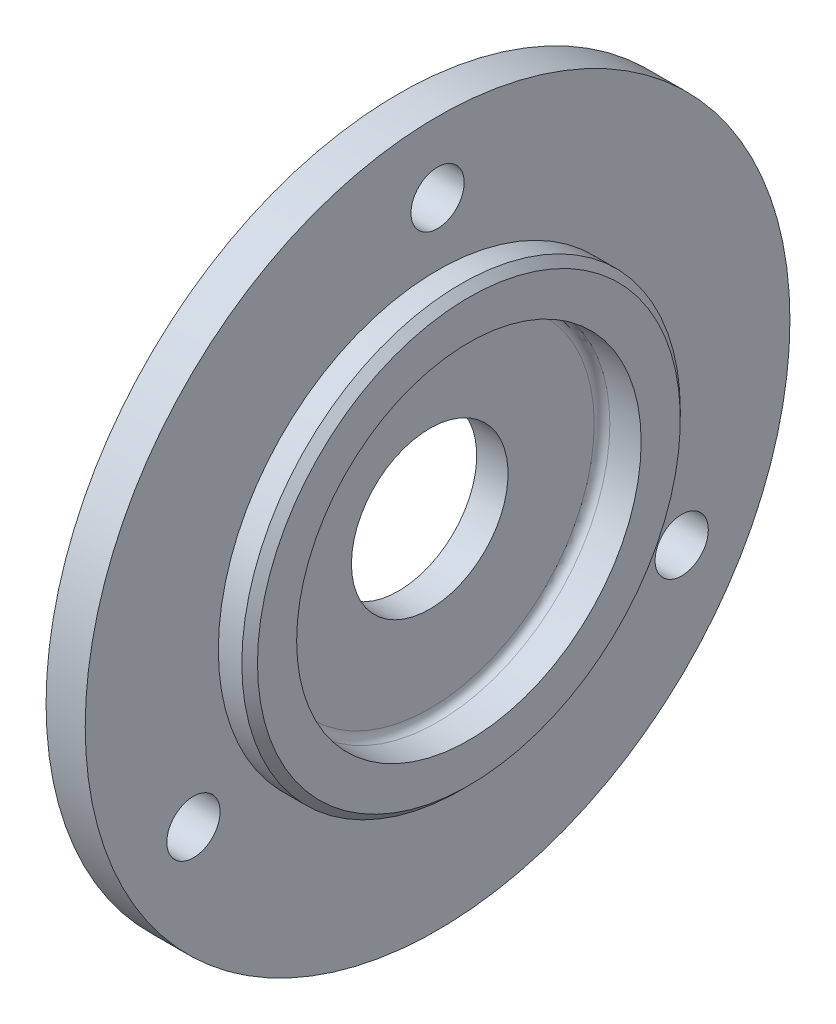
ISO-10303-21;
HEADER;
FILE_DESCRIPTION(('STEP AP214'),'2;1');
FILE_NAME('part.step','',(''),(''),'','','');
FILE_SCHEMA(('AUTOMOTIVE_DESIGN { 1 0 10303 214 1 1 1 1 }'));
ENDSEC;
DATA;
#1=APPLICATION_CONTEXT('core data for automotive mechanical design processes');
#2=APPLICATION_PROTOCOL_DEFINITION('international standard','automotive_design',2000,#1);
#3=PRODUCT_CONTEXT('',#1,'mechanical');
#4=PRODUCT('Part','Part','',(#3));
#5=PRODUCT_RELATED_PRODUCT_CATEGORY('part','',(#4));
#6=PRODUCT_DEFINITION_FORMATION('','',#4);
#7=PRODUCT_DEFINITION_CONTEXT('part definition',#1,'design');
#8=PRODUCT_DEFINITION('design','',#6,#7);
#9=PRODUCT_DEFINITION_SHAPE('','',#8);
#10=(LENGTH_UNIT() NAMED_UNIT(*) SI_UNIT(.MILLI.,.METRE.));
#11=(NAMED_UNIT(*) PLANE_ANGLE_UNIT() SI_UNIT($,.RADIAN.));
#12=(NAMED_UNIT(*) SI_UNIT($,.STERADIAN.) SOLID_ANGLE_UNIT());
#13=UNCERTAINTY_MEASURE_WITH_UNIT(LENGTH_MEASURE(1.E-05),#10,'distance_accuracy_value','');
#14=(GEOMETRIC_REPRESENTATION_CONTEXT(3) GLOBAL_UNCERTAINTY_ASSIGNED_CONTEXT((#13)) GLOBAL_UNIT_ASSIGNED_CONTEXT((#10,
#11,#12)) REPRESENTATION_CONTEXT('',''));
#15=CARTESIAN_POINT('',(0.,0.,0.));
#16=DIRECTION('',(0.,0.,1.));
#17=DIRECTION('',(1.,0.,0.));
#18=AXIS2_PLACEMENT_3D('',#15,#16,#17);
#19=CARTESIAN_POINT('',(-14.777796327212,0.,0.));
#20=DIRECTION('',(-1.,0.,0.));
#21=DIRECTION('',(0.,0.,1.));
#22=AXIS2_PLACEMENT_3D('',#19,#20,#21);
#23=CYLINDRICAL_SURFACE('',#22,5.);
#24=CARTESIAN_POINT('',(-0.499999999999997,0.,0.));
#25=DIRECTION('',(-1.,0.,0.));
#26=DIRECTION('',(0.,0.,1.));
#27=AXIS2_PLACEMENT_3D('',#24,#25,#26);
#28=CIRCLE('',#27,5.);
#29=CARTESIAN_POINT('',(-0.499999999999997,0.,5.));
#30=VERTEX_POINT('',#29);
#31=EDGE_CURVE('E64',#30,#30,#28,.T.);
#32=ORIENTED_EDGE('',*,*,#31,.F.);
#33=EDGE_LOOP('',(#32));
#34=FACE_BOUND('',#33,.T.);
#35=CARTESIAN_POINT('',(-2.5,0.,0.));
#36=DIRECTION('',(-1.,0.,0.));
#37=DIRECTION('',(0.,0.,1.));
#38=AXIS2_PLACEMENT_3D('',#35,#36,#37);
#39=CIRCLE('',#38,5.);
#40=CARTESIAN_POINT('',(-2.5,0.,5.));
#41=VERTEX_POINT('',#40);
#42=EDGE_CURVE('E10',#41,#41,#39,.T.);
#43=ORIENTED_EDGE('',*,*,#42,.T.);
#44=EDGE_LOOP('',(#43));
#45=FACE_BOUND('',#44,.T.);
#46=ADVANCED_FACE('F30',(#34,#45),#23,.F.);
#47=CARTESIAN_POINT('',(-2.5,22.5,0.));
#48=DIRECTION('',(1.,0.,0.));
#49=DIRECTION('',(0.,0.,-1.));
#50=AXIS2_PLACEMENT_3D('',#47,#48,#49);
#51=PLANE('',#50);
#52=CARTESIAN_POINT('',(-2.5,-8.99999999999985,15.58845726812));
#53=DIRECTION('',(1.,0.,0.));
#54=DIRECTION('',(0.,0.,-1.));
#55=AXIS2_PLACEMENT_3D('',#52,#53,#54);
#56=CIRCLE('',#55,1.7);
#57=CARTESIAN_POINT('',(-2.5,-8.99999999999985,13.88845726812));
#58=VERTEX_POINT('',#57);
#59=EDGE_CURVE('E79',#58,#58,#56,.T.);
#60=ORIENTED_EDGE('',*,*,#59,.T.);
#61=EDGE_LOOP('',(#60));
#62=FACE_BOUND('',#61,.T.);
#63=CARTESIAN_POINT('',(-2.5,-9.00000000000007,-15.5884572681199));
#64=DIRECTION('',(1.,0.,0.));
#65=DIRECTION('',(0.,0.,-1.));
#66=AXIS2_PLACEMENT_3D('',#63,#64,#65);
#67=CIRCLE('',#66,1.7);
#68=CARTESIAN_POINT('',(-2.5,-9.00000000000007,-17.2884572681199));
#69=VERTEX_POINT('',#68);
#70=EDGE_CURVE('E73',#69,#69,#67,.T.);
#71=ORIENTED_EDGE('',*,*,#70,.T.);
#72=EDGE_LOOP('',(#71));
#73=FACE_BOUND('',#72,.T.);
#74=CARTESIAN_POINT('',(-2.5,18.,0.));
#75=DIRECTION('',(1.,0.,0.));
#76=DIRECTION('',(0.,0.,-1.));
#77=AXIS2_PLACEMENT_3D('',#74,#75,#76);
#78=CIRCLE('',#77,1.7);
#79=CARTESIAN_POINT('',(-2.5,18.,-1.7));
#80=VERTEX_POINT('',#79);
#81=EDGE_CURVE('E67',#80,#80,#78,.T.);
#82=ORIENTED_EDGE('',*,*,#81,.T.);
#83=EDGE_LOOP('',(#82));
#84=FACE_BOUND('',#83,.T.);
#85=ORIENTED_EDGE('',*,*,#42,.F.);
#86=EDGE_LOOP('',(#85));
#87=FACE_BOUND('',#86,.T.);
#88=CARTESIAN_POINT('',(-2.5,0.,0.));
#89=DIRECTION('',(-1.,0.,0.));
#90=DIRECTION('',(0.,0.,1.));
#91=AXIS2_PLACEMENT_3D('',#88,#89,#90);
#92=CIRCLE('',#91,22.5);
#93=CARTESIAN_POINT('',(-2.5,0.,22.5));
#94=VERTEX_POINT('',#93);
#95=EDGE_CURVE('E36',#94,#94,#92,.T.);
#96=ORIENTED_EDGE('',*,*,#95,.T.);
#97=EDGE_LOOP('',(#96));
#98=FACE_BOUND('',#97,.T.);
#99=ADVANCED_FACE('F140',(#62,#73,#84,#87,#98),#51,.F.);
#100=CARTESIAN_POINT('',(-14.777796327212,0.,0.));
#101=DIRECTION('',(-1.,0.,0.));
#102=DIRECTION('',(0.,0.,1.));
#103=AXIS2_PLACEMENT_3D('',#100,#101,#102);
#104=CYLINDRICAL_SURFACE('',#103,22.5);
#105=ORIENTED_EDGE('',*,*,#95,.F.);
#106=EDGE_LOOP('',(#105));
#107=FACE_BOUND('',#106,.T.);
#108=CARTESIAN_POINT('',(0.,0.,0.));
#109=DIRECTION('',(-1.,0.,0.));
#110=DIRECTION('',(0.,0.,1.));
#111=AXIS2_PLACEMENT_3D('',#108,#109,#110);
#112=CIRCLE('',#111,22.5);
#113=CARTESIAN_POINT('',(0.,0.,22.5));
#114=VERTEX_POINT('',#113);
#115=EDGE_CURVE('E40',#114,#114,#112,.T.);
#116=ORIENTED_EDGE('',*,*,#115,.T.);
#117=EDGE_LOOP('',(#116));
#118=FACE_BOUND('',#117,.T.);
#119=ADVANCED_FACE('F93',(#107,#118),#104,.T.);
#120=CARTESIAN_POINT('',(0.,14.,0.));
#121=DIRECTION('',(-1.,0.,0.));
#122=DIRECTION('',(0.,0.,1.));
#123=AXIS2_PLACEMENT_3D('',#120,#121,#122);
#124=PLANE('',#123);
#125=CARTESIAN_POINT('',(0.,-8.99999999999985,15.58845726812));
#126=DIRECTION('',(1.,0.,0.));
#127=DIRECTION('',(0.,0.,-1.));
#128=AXIS2_PLACEMENT_3D('',#125,#126,#127);
#129=CIRCLE('',#128,1.7);
#130=CARTESIAN_POINT('',(0.,-8.99999999999985,13.88845726812));
#131=VERTEX_POINT('',#130);
#132=EDGE_CURVE('E82',#131,#131,#129,.T.);
#133=ORIENTED_EDGE('',*,*,#132,.F.);
#134=EDGE_LOOP('',(#133));
#135=FACE_BOUND('',#134,.T.);
#136=CARTESIAN_POINT('',(0.,-9.00000000000007,-15.5884572681199));
#137=DIRECTION('',(1.,0.,0.));
#138=DIRECTION('',(0.,0.,-1.));
#139=AXIS2_PLACEMENT_3D('',#136,#137,#138);
#140=CIRCLE('',#139,1.7);
#141=CARTESIAN_POINT('',(0.,-9.00000000000007,-17.2884572681199));
#142=VERTEX_POINT('',#141);
#143=EDGE_CURVE('E76',#142,#142,#140,.T.);
#144=ORIENTED_EDGE('',*,*,#143,.F.);
#145=EDGE_LOOP('',(#144));
#146=FACE_BOUND('',#145,.T.);
#147=CARTESIAN_POINT('',(0.,18.,0.));
#148=DIRECTION('',(1.,0.,0.));
#149=DIRECTION('',(0.,0.,-1.));
#150=AXIS2_PLACEMENT_3D('',#147,#148,#149);
#151=CIRCLE('',#150,1.7);
#152=CARTESIAN_POINT('',(0.,18.,-1.7));
#153=VERTEX_POINT('',#152);
#154=EDGE_CURVE('E70',#153,#153,#151,.T.);
#155=ORIENTED_EDGE('',*,*,#154,.F.);
#156=EDGE_LOOP('',(#155));
#157=FACE_BOUND('',#156,.T.);
#158=ORIENTED_EDGE('',*,*,#115,.F.);
#159=EDGE_LOOP('',(#158));
#160=FACE_BOUND('',#159,.T.);
#161=CARTESIAN_POINT('',(0.,0.,0.));
#162=DIRECTION('',(-1.,0.,0.));
#163=DIRECTION('',(0.,0.,1.));
#164=AXIS2_PLACEMENT_3D('',#161,#162,#163);
#165=CIRCLE('',#164,14.);
#166=CARTESIAN_POINT('',(0.,0.,14.));
#167=VERTEX_POINT('',#166);
#168=EDGE_CURVE('E44',#167,#167,#165,.T.);
#169=ORIENTED_EDGE('',*,*,#168,.T.);
#170=EDGE_LOOP('',(#169));
#171=FACE_BOUND('',#170,.T.);
#172=ADVANCED_FACE('F89',(#135,#146,#157,#160,#171),#124,.F.);
#173=CARTESIAN_POINT('',(-14.777796327212,0.,0.));
#174=DIRECTION('',(-1.,0.,0.));
#175=DIRECTION('',(0.,0.,1.));
#176=AXIS2_PLACEMENT_3D('',#173,#174,#175);
#177=CYLINDRICAL_SURFACE('',#176,14.);
#178=ORIENTED_EDGE('',*,*,#168,.F.);
#179=EDGE_LOOP('',(#178));
#180=FACE_BOUND('',#179,.T.);
#181=CARTESIAN_POINT('',(1.5,0.,0.));
#182=DIRECTION('',(-1.,0.,0.));
#183=DIRECTION('',(0.,0.,1.));
#184=AXIS2_PLACEMENT_3D('',#181,#182,#183);
#185=CIRCLE('',#184,14.);
#186=CARTESIAN_POINT('',(1.5,0.,14.));
#187=VERTEX_POINT('',#186);
#188=EDGE_CURVE('E49',#187,#187,#185,.T.);
#189=ORIENTED_EDGE('',*,*,#188,.T.);
#190=EDGE_LOOP('',(#189));
#191=FACE_BOUND('',#190,.T.);
#192=ADVANCED_FACE('F92',(#180,#191),#177,.T.);
#193=CARTESIAN_POINT('',(2.,0.,0.));
#194=DIRECTION('',(-1.,0.,0.));
#195=DIRECTION('',(0.,0.,1.));
#196=AXIS2_PLACEMENT_3D('',#193,#194,#195);
#197=CONICAL_SURFACE('',#196,13.5,0.785398163397447);
#198=ORIENTED_EDGE('',*,*,#188,.F.);
#199=EDGE_LOOP('',(#198));
#200=FACE_BOUND('',#199,.T.);
#201=CARTESIAN_POINT('',(2.,0.,0.));
#202=DIRECTION('',(-1.,0.,0.));
#203=DIRECTION('',(0.,0.,1.));
#204=AXIS2_PLACEMENT_3D('',#201,#202,#203);
#205=CIRCLE('',#204,13.5);
#206=CARTESIAN_POINT('',(2.,0.,13.5));
#207=VERTEX_POINT('',#206);
#208=EDGE_CURVE('E52',#207,#207,#205,.T.);
#209=ORIENTED_EDGE('',*,*,#208,.T.);
#210=EDGE_LOOP('',(#209));
#211=FACE_BOUND('',#210,.T.);
#212=ADVANCED_FACE('F105',(#200,#211),#197,.T.);
#213=CARTESIAN_POINT('',(2.,11.,0.));
#214=DIRECTION('',(-1.,0.,0.));
#215=DIRECTION('',(0.,0.,1.));
#216=AXIS2_PLACEMENT_3D('',#213,#214,#215);
#217=PLANE('',#216);
#218=ORIENTED_EDGE('',*,*,#208,.F.);
#219=EDGE_LOOP('',(#218));
#220=FACE_BOUND('',#219,.T.);
#221=CARTESIAN_POINT('',(2.,0.,0.));
#222=DIRECTION('',(-1.,0.,0.));
#223=DIRECTION('',(0.,0.,1.));
#224=AXIS2_PLACEMENT_3D('',#221,#222,#223);
#225=CIRCLE('',#224,11.);
#226=CARTESIAN_POINT('',(2.,0.,11.));
#227=VERTEX_POINT('',#226);
#228=EDGE_CURVE('E55',#227,#227,#225,.T.);
#229=ORIENTED_EDGE('',*,*,#228,.T.);
#230=EDGE_LOOP('',(#229));
#231=FACE_BOUND('',#230,.T.);
#232=ADVANCED_FACE('F111',(#220,#231),#217,.F.);
#233=CARTESIAN_POINT('',(-14.777796327212,0.,0.));
#234=DIRECTION('',(-1.,0.,0.));
#235=DIRECTION('',(0.,0.,1.));
#236=AXIS2_PLACEMENT_3D('',#233,#234,#235);
#237=CYLINDRICAL_SURFACE('',#236,11.);
#238=ORIENTED_EDGE('',*,*,#228,.F.);
#239=EDGE_LOOP('',(#238));
#240=FACE_BOUND('',#239,.T.);
#241=CARTESIAN_POINT('',(0.,0.,0.));
#242=DIRECTION('',(-1.,0.,0.));
#243=DIRECTION('',(0.,0.,1.));
#244=AXIS2_PLACEMENT_3D('',#241,#242,#243);
#245=CIRCLE('',#244,11.);
#246=CARTESIAN_POINT('',(0.,0.,11.));
#247=VERTEX_POINT('',#246);
#248=EDGE_CURVE('E58',#247,#247,#245,.T.);
#249=ORIENTED_EDGE('',*,*,#248,.T.);
#250=EDGE_LOOP('',(#249));
#251=FACE_BOUND('',#250,.T.);
#252=ADVANCED_FACE('F117',(#240,#251),#237,.F.);
#253=CARTESIAN_POINT('',(0.,0.,0.));
#254=DIRECTION('',(-1.,0.,0.));
#255=DIRECTION('',(0.,0.,1.));
#256=AXIS2_PLACEMENT_3D('',#253,#254,#255);
#257=TOROIDAL_SURFACE('',#256,10.5,0.5);
#258=ORIENTED_EDGE('',*,*,#248,.F.);
#259=EDGE_LOOP('',(#258));
#260=FACE_BOUND('',#259,.T.);
#261=CARTESIAN_POINT('',(-0.499999999999997,0.,0.));
#262=DIRECTION('',(-1.,0.,0.));
#263=DIRECTION('',(0.,0.,1.));
#264=AXIS2_PLACEMENT_3D('',#261,#262,#263);
#265=CIRCLE('',#264,10.5);
#266=CARTESIAN_POINT('',(-0.499999999999997,0.,10.5));
#267=VERTEX_POINT('',#266);
#268=EDGE_CURVE('E61',#267,#267,#265,.T.);
#269=ORIENTED_EDGE('',*,*,#268,.T.);
#270=EDGE_LOOP('',(#269));
#271=FACE_BOUND('',#270,.T.);
#272=ADVANCED_FACE('F123',(#260,#271),#257,.F.);
#273=CARTESIAN_POINT('',(-0.499999999999998,5.,0.));
#274=DIRECTION('',(-1.,0.,0.));
#275=DIRECTION('',(0.,0.,1.));
#276=AXIS2_PLACEMENT_3D('',#273,#274,#275);
#277=PLANE('',#276);
#278=ORIENTED_EDGE('',*,*,#268,.F.);
#279=EDGE_LOOP('',(#278));
#280=FACE_BOUND('',#279,.T.);
#281=ORIENTED_EDGE('',*,*,#31,.T.);
#282=EDGE_LOOP('',(#281));
#283=FACE_BOUND('',#282,.T.);
#284=ADVANCED_FACE('F129',(#280,#283),#277,.F.);
#285=CARTESIAN_POINT('',(-10.,18.,0.));
#286=DIRECTION('',(1.,0.,0.));
#287=DIRECTION('',(0.,0.,-1.));
#288=AXIS2_PLACEMENT_3D('',#285,#286,#287);
#289=CYLINDRICAL_SURFACE('',#288,1.7);
#290=ORIENTED_EDGE('',*,*,#154,.T.);
#291=EDGE_LOOP('',(#290));
#292=FACE_BOUND('',#291,.T.);
#293=ORIENTED_EDGE('',*,*,#81,.F.);
#294=EDGE_LOOP('',(#293));
#295=FACE_BOUND('',#294,.T.);
#296=ADVANCED_FACE('F135',(#292,#295),#289,.F.);
#297=CARTESIAN_POINT('',(-10.,-9.00000000000007,-15.5884572681199));
#298=DIRECTION('',(1.,0.,0.));
#299=DIRECTION('',(0.,0.,-1.));
#300=AXIS2_PLACEMENT_3D('',#297,#298,#299);
#301=CYLINDRICAL_SURFACE('',#300,1.7);
#302=ORIENTED_EDGE('',*,*,#143,.T.);
#303=EDGE_LOOP('',(#302));
#304=FACE_BOUND('',#303,.T.);
#305=ORIENTED_EDGE('',*,*,#70,.F.);
#306=EDGE_LOOP('',(#305));
#307=FACE_BOUND('',#306,.T.);
#308=ADVANCED_FACE('F154',(#304,#307),#301,.F.);
#309=CARTESIAN_POINT('',(-10.,-8.99999999999985,15.58845726812));
#310=DIRECTION('',(1.,0.,0.));
#311=DIRECTION('',(0.,0.,-1.));
#312=AXIS2_PLACEMENT_3D('',#309,#310,#311);
#313=CYLINDRICAL_SURFACE('',#312,1.7);
#314=ORIENTED_EDGE('',*,*,#132,.T.);
#315=EDGE_LOOP('',(#314));
#316=FACE_BOUND('',#315,.T.);
#317=ORIENTED_EDGE('',*,*,#59,.F.);
#318=EDGE_LOOP('',(#317));
#319=FACE_BOUND('',#318,.T.);
#320=ADVANCED_FACE('F86',(#316,#319),#313,.F.);
#321=CLOSED_SHELL('',(#46,#99,#119,#172,#192,#212,#232,#252,#272,#284,#296,#308,#320));
#322=MANIFOLD_SOLID_BREP('B2',#321);
#323=ADVANCED_BREP_SHAPE_REPRESENTATION('',(#18,#322),#14);
#324=SHAPE_DEFINITION_REPRESENTATION(#9,#323);
ENDSEC;
END-ISO-10303-21;
